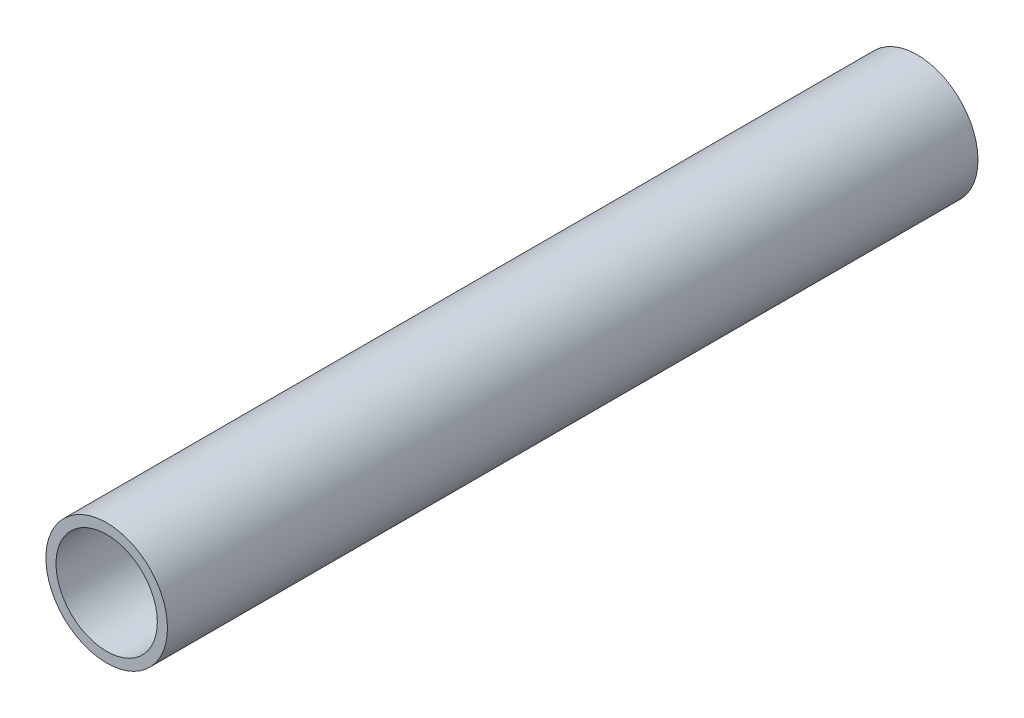
ISO-10303-21;
HEADER;
FILE_DESCRIPTION(('STEP AP214'),'2;1');
FILE_NAME('part.step','',(''),(''),'','','');
FILE_SCHEMA(('AUTOMOTIVE_DESIGN { 1 0 10303 214 1 1 1 1 }'));
ENDSEC;
DATA;
#1=APPLICATION_CONTEXT('core data for automotive mechanical design processes');
#2=APPLICATION_PROTOCOL_DEFINITION('international standard','automotive_design',2000,#1);
#3=PRODUCT_CONTEXT('',#1,'mechanical');
#4=PRODUCT('Part','Part','',(#3));
#5=PRODUCT_RELATED_PRODUCT_CATEGORY('part','',(#4));
#6=PRODUCT_DEFINITION_FORMATION('','',#4);
#7=PRODUCT_DEFINITION_CONTEXT('part definition',#1,'design');
#8=PRODUCT_DEFINITION('design','',#6,#7);
#9=PRODUCT_DEFINITION_SHAPE('','',#8);
#10=(LENGTH_UNIT() NAMED_UNIT(*) SI_UNIT(.MILLI.,.METRE.));
#11=(NAMED_UNIT(*) PLANE_ANGLE_UNIT() SI_UNIT($,.RADIAN.));
#12=(NAMED_UNIT(*) SI_UNIT($,.STERADIAN.) SOLID_ANGLE_UNIT());
#13=UNCERTAINTY_MEASURE_WITH_UNIT(LENGTH_MEASURE(1.E-05),#10,'distance_accuracy_value','');
#14=(GEOMETRIC_REPRESENTATION_CONTEXT(3) GLOBAL_UNCERTAINTY_ASSIGNED_CONTEXT((#13)) GLOBAL_UNIT_ASSIGNED_CONTEXT((#10,
#11,#12)) REPRESENTATION_CONTEXT('',''));
#15=CARTESIAN_POINT('',(0.,0.,0.));
#16=DIRECTION('',(0.,0.,1.));
#17=DIRECTION('',(1.,0.,0.));
#18=AXIS2_PLACEMENT_3D('',#15,#16,#17);
#19=CARTESIAN_POINT('',(0.,0.,80.));
#20=DIRECTION('',(0.,0.,1.));
#21=DIRECTION('',(1.,0.,0.));
#22=AXIS2_PLACEMENT_3D('',#19,#20,#21);
#23=PLANE('',#22);
#24=CARTESIAN_POINT('',(0.,0.,80.));
#25=DIRECTION('',(0.,0.,1.));
#26=DIRECTION('',(1.,0.,0.));
#27=AXIS2_PLACEMENT_3D('',#24,#25,#26);
#28=CIRCLE('',#27,6.);
#29=CARTESIAN_POINT('',(6.,0.,80.));
#30=VERTEX_POINT('',#29);
#31=EDGE_CURVE('E10',#30,#30,#28,.T.);
#32=ORIENTED_EDGE('',*,*,#31,.T.);
#33=EDGE_LOOP('',(#32));
#34=FACE_BOUND('',#33,.T.);
#35=CARTESIAN_POINT('',(0.,0.,80.));
#36=DIRECTION('',(0.,0.,1.));
#37=DIRECTION('',(1.,0.,0.));
#38=AXIS2_PLACEMENT_3D('',#35,#36,#37);
#39=CIRCLE('',#38,5.);
#40=CARTESIAN_POINT('',(5.,0.,80.));
#41=VERTEX_POINT('',#40);
#42=EDGE_CURVE('E58',#41,#41,#39,.T.);
#43=ORIENTED_EDGE('',*,*,#42,.F.);
#44=EDGE_LOOP('',(#43));
#45=FACE_BOUND('',#44,.T.);
#46=ADVANCED_FACE('F45',(#34,#45),#23,.T.);
#47=CARTESIAN_POINT('',(0.,0.,0.));
#48=DIRECTION('',(0.,0.,1.));
#49=DIRECTION('',(1.,0.,0.));
#50=AXIS2_PLACEMENT_3D('',#47,#48,#49);
#51=PLANE('',#50);
#52=CARTESIAN_POINT('',(0.,0.,0.));
#53=DIRECTION('',(0.,0.,1.));
#54=DIRECTION('',(1.,0.,0.));
#55=AXIS2_PLACEMENT_3D('',#52,#53,#54);
#56=CIRCLE('',#55,6.);
#57=CARTESIAN_POINT('',(6.,0.,0.));
#58=VERTEX_POINT('',#57);
#59=EDGE_CURVE('E49',#58,#58,#56,.T.);
#60=ORIENTED_EDGE('',*,*,#59,.F.);
#61=EDGE_LOOP('',(#60));
#62=FACE_BOUND('',#61,.T.);
#63=CARTESIAN_POINT('',(0.,0.,0.));
#64=DIRECTION('',(0.,0.,1.));
#65=DIRECTION('',(1.,0.,0.));
#66=AXIS2_PLACEMENT_3D('',#63,#64,#65);
#67=CIRCLE('',#66,5.);
#68=CARTESIAN_POINT('',(5.,0.,0.));
#69=VERTEX_POINT('',#68);
#70=EDGE_CURVE('E60',#69,#69,#67,.T.);
#71=ORIENTED_EDGE('',*,*,#70,.T.);
#72=EDGE_LOOP('',(#71));
#73=FACE_BOUND('',#72,.T.);
#74=ADVANCED_FACE('F72',(#62,#73),#51,.F.);
#75=CARTESIAN_POINT('',(0.,0.,80.));
#76=DIRECTION('',(0.,0.,-1.));
#77=DIRECTION('',(-1.,0.,0.));
#78=AXIS2_PLACEMENT_3D('',#75,#76,#77);
#79=CYLINDRICAL_SURFACE('',#78,6.);
#80=ORIENTED_EDGE('',*,*,#31,.F.);
#81=EDGE_LOOP('',(#80));
#82=FACE_BOUND('',#81,.T.);
#83=ORIENTED_EDGE('',*,*,#59,.T.);
#84=EDGE_LOOP('',(#83));
#85=FACE_BOUND('',#84,.T.);
#86=ADVANCED_FACE('F47',(#82,#85),#79,.T.);
#87=CARTESIAN_POINT('',(0.,0.,80.));
#88=DIRECTION('',(0.,0.,-1.));
#89=DIRECTION('',(-1.,0.,0.));
#90=AXIS2_PLACEMENT_3D('',#87,#88,#89);
#91=CYLINDRICAL_SURFACE('',#90,5.);
#92=ORIENTED_EDGE('',*,*,#42,.T.);
#93=EDGE_LOOP('',(#92));
#94=FACE_BOUND('',#93,.T.);
#95=ORIENTED_EDGE('',*,*,#70,.F.);
#96=EDGE_LOOP('',(#95));
#97=FACE_BOUND('',#96,.T.);
#98=ADVANCED_FACE('F68',(#94,#97),#91,.F.);
#99=CLOSED_SHELL('',(#46,#74,#86,#98));
#100=MANIFOLD_SOLID_BREP('B2',#99);
#101=ADVANCED_BREP_SHAPE_REPRESENTATION('',(#18,#100),#14);
#102=SHAPE_DEFINITION_REPRESENTATION(#9,#101);
ENDSEC;
END-ISO-10303-21;
